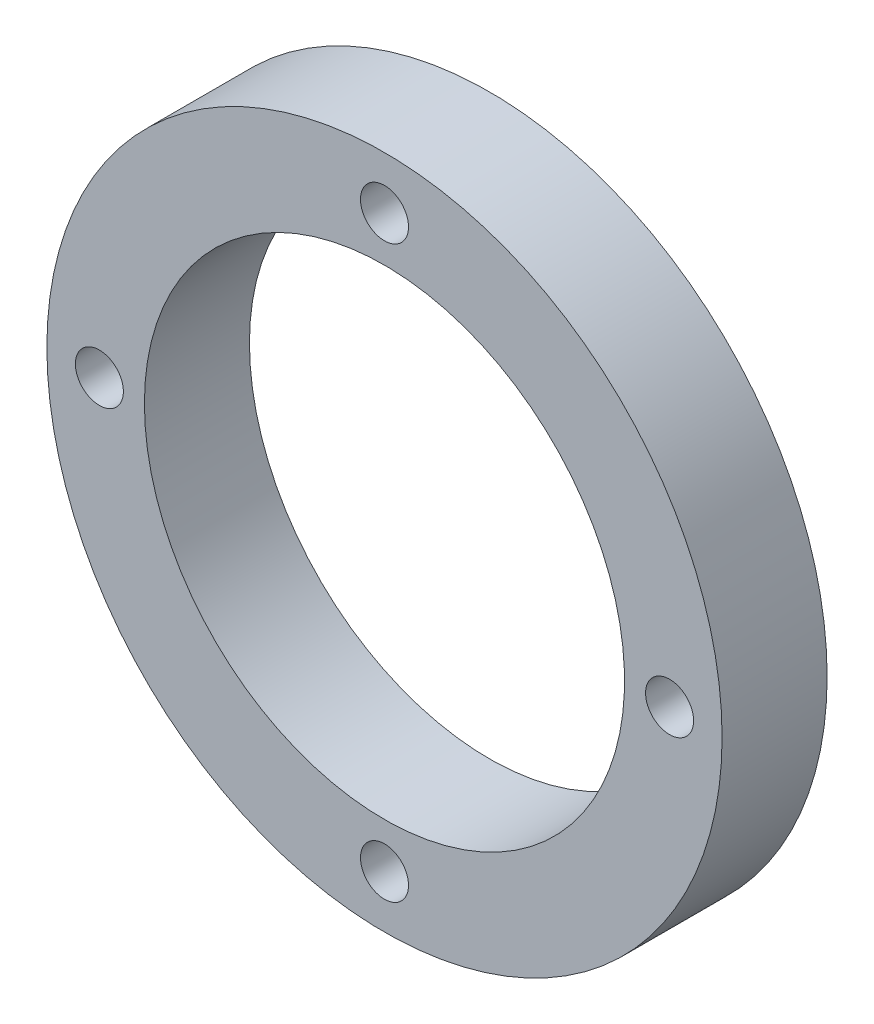
ISO-10303-21;
HEADER;
FILE_DESCRIPTION(('STEP AP214'),'2;1');
FILE_NAME('part.step','',(''),(''),'','','');
FILE_SCHEMA(('AUTOMOTIVE_DESIGN { 1 0 10303 214 1 1 1 1 }'));
ENDSEC;
DATA;
#1=APPLICATION_CONTEXT('core data for automotive mechanical design processes');
#2=APPLICATION_PROTOCOL_DEFINITION('international standard','automotive_design',2000,#1);
#3=PRODUCT_CONTEXT('',#1,'mechanical');
#4=PRODUCT('Part','Part','',(#3));
#5=PRODUCT_RELATED_PRODUCT_CATEGORY('part','',(#4));
#6=PRODUCT_DEFINITION_FORMATION('','',#4);
#7=PRODUCT_DEFINITION_CONTEXT('part definition',#1,'design');
#8=PRODUCT_DEFINITION('design','',#6,#7);
#9=PRODUCT_DEFINITION_SHAPE('','',#8);
#10=(LENGTH_UNIT() NAMED_UNIT(*) SI_UNIT(.MILLI.,.METRE.));
#11=(NAMED_UNIT(*) PLANE_ANGLE_UNIT() SI_UNIT($,.RADIAN.));
#12=(NAMED_UNIT(*) SI_UNIT($,.STERADIAN.) SOLID_ANGLE_UNIT());
#13=UNCERTAINTY_MEASURE_WITH_UNIT(LENGTH_MEASURE(1.E-05),#10,'distance_accuracy_value','');
#14=(GEOMETRIC_REPRESENTATION_CONTEXT(3) GLOBAL_UNCERTAINTY_ASSIGNED_CONTEXT((#13)) GLOBAL_UNIT_ASSIGNED_CONTEXT((#10,
#11,#12)) REPRESENTATION_CONTEXT('',''));
#15=CARTESIAN_POINT('',(0.,0.,0.));
#16=DIRECTION('',(0.,0.,1.));
#17=DIRECTION('',(1.,0.,0.));
#18=AXIS2_PLACEMENT_3D('',#15,#16,#17);
#19=CARTESIAN_POINT('',(0.,0.,0.));
#20=DIRECTION('',(0.,0.,1.));
#21=DIRECTION('',(1.,0.,0.));
#22=AXIS2_PLACEMENT_3D('',#19,#20,#21);
#23=PLANE('',#22);
#24=CARTESIAN_POINT('',(0.,0.,0.));
#25=DIRECTION('',(0.,0.,-1.));
#26=DIRECTION('',(-1.,0.,0.));
#27=AXIS2_PLACEMENT_3D('',#24,#25,#26);
#28=CIRCLE('',#27,16.);
#29=CARTESIAN_POINT('',(-16.,0.,0.));
#30=VERTEX_POINT('',#29);
#31=EDGE_CURVE('E41',#30,#30,#28,.F.);
#32=ORIENTED_EDGE('',*,*,#31,.T.);
#33=EDGE_LOOP('',(#32));
#34=FACE_BOUND('',#33,.T.);
#35=CARTESIAN_POINT('',(0.,0.,0.));
#36=DIRECTION('',(0.,0.,-1.));
#37=DIRECTION('',(-1.,0.,0.));
#38=AXIS2_PLACEMENT_3D('',#35,#36,#37);
#39=CIRCLE('',#38,22.5);
#40=CARTESIAN_POINT('',(-22.5,0.,0.));
#41=VERTEX_POINT('',#40);
#42=EDGE_CURVE('E44',#41,#41,#39,.F.);
#43=ORIENTED_EDGE('',*,*,#42,.F.);
#44=EDGE_LOOP('',(#43));
#45=FACE_BOUND('',#44,.T.);
#46=CARTESIAN_POINT('',(0.,19.,0.));
#47=DIRECTION('',(0.,0.,1.));
#48=DIRECTION('',(1.,0.,0.));
#49=AXIS2_PLACEMENT_3D('',#46,#47,#48);
#50=CIRCLE('',#49,1.6);
#51=CARTESIAN_POINT('',(1.6,19.,0.));
#52=VERTEX_POINT('',#51);
#53=EDGE_CURVE('E47',#52,#52,#50,.T.);
#54=ORIENTED_EDGE('',*,*,#53,.T.);
#55=EDGE_LOOP('',(#54));
#56=FACE_BOUND('',#55,.T.);
#57=CARTESIAN_POINT('',(19.,0.,0.));
#58=DIRECTION('',(0.,0.,1.));
#59=DIRECTION('',(1.,0.,0.));
#60=AXIS2_PLACEMENT_3D('',#57,#58,#59);
#61=CIRCLE('',#60,1.6);
#62=CARTESIAN_POINT('',(20.6,0.,0.));
#63=VERTEX_POINT('',#62);
#64=EDGE_CURVE('E50',#63,#63,#61,.T.);
#65=ORIENTED_EDGE('',*,*,#64,.T.);
#66=EDGE_LOOP('',(#65));
#67=FACE_BOUND('',#66,.T.);
#68=CARTESIAN_POINT('',(0.,-19.,0.));
#69=DIRECTION('',(0.,0.,1.));
#70=DIRECTION('',(1.,0.,0.));
#71=AXIS2_PLACEMENT_3D('',#68,#69,#70);
#72=CIRCLE('',#71,1.6);
#73=CARTESIAN_POINT('',(1.6,-19.,0.));
#74=VERTEX_POINT('',#73);
#75=EDGE_CURVE('E52',#74,#74,#72,.T.);
#76=ORIENTED_EDGE('',*,*,#75,.T.);
#77=EDGE_LOOP('',(#76));
#78=FACE_BOUND('',#77,.T.);
#79=CARTESIAN_POINT('',(-19.,1.99014436314059E-13,0.));
#80=DIRECTION('',(0.,0.,1.));
#81=DIRECTION('',(1.,0.,0.));
#82=AXIS2_PLACEMENT_3D('',#79,#80,#81);
#83=CIRCLE('',#82,1.6);
#84=CARTESIAN_POINT('',(-17.4,1.99014436314059E-13,0.));
#85=VERTEX_POINT('',#84);
#86=EDGE_CURVE('E18',#85,#85,#83,.T.);
#87=ORIENTED_EDGE('',*,*,#86,.T.);
#88=EDGE_LOOP('',(#87));
#89=FACE_BOUND('',#88,.T.);
#90=ADVANCED_FACE('F15',(#34,#45,#56,#67,#78,#89),#23,.F.);
#91=CARTESIAN_POINT('',(-19.,1.99014436314059E-13,0.));
#92=DIRECTION('',(0.,0.,1.));
#93=DIRECTION('',(1.,0.,0.));
#94=AXIS2_PLACEMENT_3D('',#91,#92,#93);
#95=CYLINDRICAL_SURFACE('',#94,1.6);
#96=CARTESIAN_POINT('',(-19.,1.99014436314059E-13,7.));
#97=DIRECTION('',(0.,0.,1.));
#98=DIRECTION('',(1.,0.,0.));
#99=AXIS2_PLACEMENT_3D('',#96,#97,#98);
#100=CIRCLE('',#99,1.6);
#101=CARTESIAN_POINT('',(-17.4,1.99014436314059E-13,7.));
#102=VERTEX_POINT('',#101);
#103=EDGE_CURVE('E38',#102,#102,#100,.F.);
#104=ORIENTED_EDGE('',*,*,#103,.F.);
#105=EDGE_LOOP('',(#104));
#106=FACE_BOUND('',#105,.T.);
#107=ORIENTED_EDGE('',*,*,#86,.F.);
#108=EDGE_LOOP('',(#107));
#109=FACE_BOUND('',#108,.T.);
#110=ADVANCED_FACE('F60',(#106,#109),#95,.F.);
#111=CARTESIAN_POINT('',(0.,-19.,0.));
#112=DIRECTION('',(0.,0.,1.));
#113=DIRECTION('',(1.,0.,0.));
#114=AXIS2_PLACEMENT_3D('',#111,#112,#113);
#115=CYLINDRICAL_SURFACE('',#114,1.6);
#116=CARTESIAN_POINT('',(0.,-19.,7.));
#117=DIRECTION('',(0.,0.,1.));
#118=DIRECTION('',(1.,0.,0.));
#119=AXIS2_PLACEMENT_3D('',#116,#117,#118);
#120=CIRCLE('',#119,1.6);
#121=CARTESIAN_POINT('',(1.6,-19.,7.));
#122=VERTEX_POINT('',#121);
#123=EDGE_CURVE('E35',#122,#122,#120,.F.);
#124=ORIENTED_EDGE('',*,*,#123,.F.);
#125=EDGE_LOOP('',(#124));
#126=FACE_BOUND('',#125,.T.);
#127=ORIENTED_EDGE('',*,*,#75,.F.);
#128=EDGE_LOOP('',(#127));
#129=FACE_BOUND('',#128,.T.);
#130=ADVANCED_FACE('F62',(#126,#129),#115,.F.);
#131=CARTESIAN_POINT('',(19.,0.,0.));
#132=DIRECTION('',(0.,0.,1.));
#133=DIRECTION('',(1.,0.,0.));
#134=AXIS2_PLACEMENT_3D('',#131,#132,#133);
#135=CYLINDRICAL_SURFACE('',#134,1.6);
#136=CARTESIAN_POINT('',(19.,0.,7.));
#137=DIRECTION('',(0.,0.,1.));
#138=DIRECTION('',(1.,0.,0.));
#139=AXIS2_PLACEMENT_3D('',#136,#137,#138);
#140=CIRCLE('',#139,1.6);
#141=CARTESIAN_POINT('',(20.6,0.,7.));
#142=VERTEX_POINT('',#141);
#143=EDGE_CURVE('E32',#142,#142,#140,.F.);
#144=ORIENTED_EDGE('',*,*,#143,.F.);
#145=EDGE_LOOP('',(#144));
#146=FACE_BOUND('',#145,.T.);
#147=ORIENTED_EDGE('',*,*,#64,.F.);
#148=EDGE_LOOP('',(#147));
#149=FACE_BOUND('',#148,.T.);
#150=ADVANCED_FACE('F69',(#146,#149),#135,.F.);
#151=CARTESIAN_POINT('',(0.,19.,0.));
#152=DIRECTION('',(0.,0.,1.));
#153=DIRECTION('',(1.,0.,0.));
#154=AXIS2_PLACEMENT_3D('',#151,#152,#153);
#155=CYLINDRICAL_SURFACE('',#154,1.6);
#156=CARTESIAN_POINT('',(0.,19.,7.));
#157=DIRECTION('',(0.,0.,1.));
#158=DIRECTION('',(1.,0.,0.));
#159=AXIS2_PLACEMENT_3D('',#156,#157,#158);
#160=CIRCLE('',#159,1.6);
#161=CARTESIAN_POINT('',(1.6,19.,7.));
#162=VERTEX_POINT('',#161);
#163=EDGE_CURVE('E27',#162,#162,#160,.F.);
#164=ORIENTED_EDGE('',*,*,#163,.F.);
#165=EDGE_LOOP('',(#164));
#166=FACE_BOUND('',#165,.T.);
#167=ORIENTED_EDGE('',*,*,#53,.F.);
#168=EDGE_LOOP('',(#167));
#169=FACE_BOUND('',#168,.T.);
#170=ADVANCED_FACE('F88',(#166,#169),#155,.F.);
#171=CARTESIAN_POINT('',(0.,0.,7.));
#172=DIRECTION('',(0.,0.,-1.));
#173=DIRECTION('',(-1.,0.,0.));
#174=AXIS2_PLACEMENT_3D('',#171,#172,#173);
#175=CYLINDRICAL_SURFACE('',#174,22.5);
#176=ORIENTED_EDGE('',*,*,#42,.T.);
#177=EDGE_LOOP('',(#176));
#178=FACE_BOUND('',#177,.T.);
#179=CARTESIAN_POINT('',(0.,0.,7.));
#180=DIRECTION('',(0.,0.,-1.));
#181=DIRECTION('',(-1.,0.,0.));
#182=AXIS2_PLACEMENT_3D('',#179,#180,#181);
#183=CIRCLE('',#182,22.5);
#184=CARTESIAN_POINT('',(-22.5,0.,7.));
#185=VERTEX_POINT('',#184);
#186=EDGE_CURVE('E22',#185,#185,#183,.F.);
#187=ORIENTED_EDGE('',*,*,#186,.F.);
#188=EDGE_LOOP('',(#187));
#189=FACE_BOUND('',#188,.T.);
#190=ADVANCED_FACE('F81',(#178,#189),#175,.T.);
#191=CARTESIAN_POINT('',(0.,0.,7.));
#192=DIRECTION('',(0.,0.,-1.));
#193=DIRECTION('',(-1.,0.,0.));
#194=AXIS2_PLACEMENT_3D('',#191,#192,#193);
#195=CYLINDRICAL_SURFACE('',#194,16.);
#196=CARTESIAN_POINT('',(0.,0.,7.));
#197=DIRECTION('',(0.,0.,-1.));
#198=DIRECTION('',(-1.,0.,0.));
#199=AXIS2_PLACEMENT_3D('',#196,#197,#198);
#200=CIRCLE('',#199,16.);
#201=CARTESIAN_POINT('',(-16.,0.,7.));
#202=VERTEX_POINT('',#201);
#203=EDGE_CURVE('E10',#202,#202,#200,.T.);
#204=ORIENTED_EDGE('',*,*,#203,.F.);
#205=EDGE_LOOP('',(#204));
#206=FACE_BOUND('',#205,.T.);
#207=ORIENTED_EDGE('',*,*,#31,.F.);
#208=EDGE_LOOP('',(#207));
#209=FACE_BOUND('',#208,.T.);
#210=ADVANCED_FACE('F76',(#206,#209),#195,.F.);
#211=CARTESIAN_POINT('',(0.,0.,7.));
#212=DIRECTION('',(0.,0.,1.));
#213=DIRECTION('',(1.,0.,0.));
#214=AXIS2_PLACEMENT_3D('',#211,#212,#213);
#215=PLANE('',#214);
#216=ORIENTED_EDGE('',*,*,#203,.T.);
#217=EDGE_LOOP('',(#216));
#218=FACE_BOUND('',#217,.T.);
#219=ORIENTED_EDGE('',*,*,#186,.T.);
#220=EDGE_LOOP('',(#219));
#221=FACE_BOUND('',#220,.T.);
#222=ORIENTED_EDGE('',*,*,#163,.T.);
#223=EDGE_LOOP('',(#222));
#224=FACE_BOUND('',#223,.T.);
#225=ORIENTED_EDGE('',*,*,#143,.T.);
#226=EDGE_LOOP('',(#225));
#227=FACE_BOUND('',#226,.T.);
#228=ORIENTED_EDGE('',*,*,#123,.T.);
#229=EDGE_LOOP('',(#228));
#230=FACE_BOUND('',#229,.T.);
#231=ORIENTED_EDGE('',*,*,#103,.T.);
#232=EDGE_LOOP('',(#231));
#233=FACE_BOUND('',#232,.T.);
#234=ADVANCED_FACE('F74',(#218,#221,#224,#227,#230,#233),#215,.T.);
#235=CLOSED_SHELL('',(#90,#110,#130,#150,#170,#190,#210,#234));
#236=MANIFOLD_SOLID_BREP('B1',#235);
#237=ADVANCED_BREP_SHAPE_REPRESENTATION('',(#18,#236),#14);
#238=SHAPE_DEFINITION_REPRESENTATION(#9,#237);
ENDSEC;
END-ISO-10303-21;
